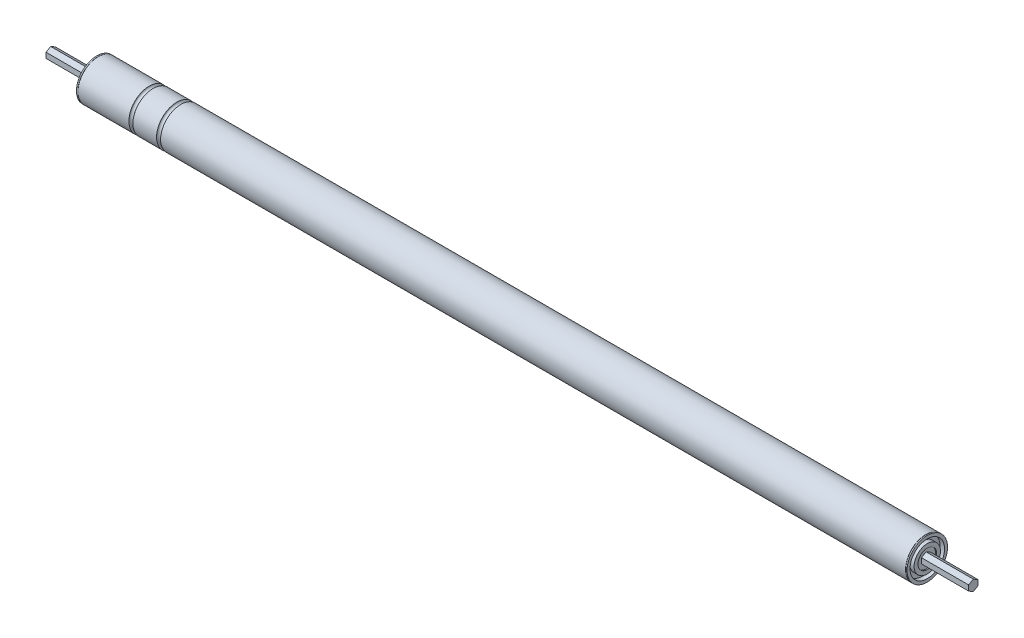
ISO-10303-21;
HEADER;
FILE_DESCRIPTION(('STEP AP214'),'2;1');
FILE_NAME('part.step','',(''),(''),'','','');
FILE_SCHEMA(('AUTOMOTIVE_DESIGN { 1 0 10303 214 1 1 1 1 }'));
ENDSEC;
DATA;
#1=APPLICATION_CONTEXT('core data for automotive mechanical design processes');
#2=APPLICATION_PROTOCOL_DEFINITION('international standard','automotive_design',2000,#1);
#3=PRODUCT_CONTEXT('',#1,'mechanical');
#4=PRODUCT('Part','Part','',(#3));
#5=PRODUCT_RELATED_PRODUCT_CATEGORY('part','',(#4));
#6=PRODUCT_DEFINITION_FORMATION('','',#4);
#7=PRODUCT_DEFINITION_CONTEXT('part definition',#1,'design');
#8=PRODUCT_DEFINITION('design','',#6,#7);
#9=PRODUCT_DEFINITION_SHAPE('','',#8);
#10=(LENGTH_UNIT() NAMED_UNIT(*) SI_UNIT(.MILLI.,.METRE.));
#11=(NAMED_UNIT(*) PLANE_ANGLE_UNIT() SI_UNIT($,.RADIAN.));
#12=(NAMED_UNIT(*) SI_UNIT($,.STERADIAN.) SOLID_ANGLE_UNIT());
#13=UNCERTAINTY_MEASURE_WITH_UNIT(LENGTH_MEASURE(1.E-05),#10,'distance_accuracy_value','');
#14=(GEOMETRIC_REPRESENTATION_CONTEXT(3) GLOBAL_UNCERTAINTY_ASSIGNED_CONTEXT((#13)) GLOBAL_UNIT_ASSIGNED_CONTEXT((#10,
#11,#12)) REPRESENTATION_CONTEXT('',''));
#15=CARTESIAN_POINT('',(0.,0.,0.));
#16=DIRECTION('',(0.,0.,1.));
#17=DIRECTION('',(1.,0.,0.));
#18=AXIS2_PLACEMENT_3D('',#15,#16,#17);
#19=CARTESIAN_POINT('',(556.234821520125,0.,0.));
#20=DIRECTION('',(-1.,0.,0.));
#21=DIRECTION('',(0.,0.,1.));
#22=AXIS2_PLACEMENT_3D('',#19,#20,#21);
#23=CYLINDRICAL_SURFACE('',#22,24.13);
#24=CARTESIAN_POINT('',(-427.830678291306,1.37139780605819E-13,0.));
#25=DIRECTION('',(1.,0.,0.));
#26=DIRECTION('',(0.,1.,0.));
#27=AXIS2_PLACEMENT_3D('',#24,#25,#26);
#28=CIRCLE('',#27,24.13);
#29=CARTESIAN_POINT('',(-427.830678291306,24.1300000000001,0.));
#30=VERTEX_POINT('',#29);
#31=EDGE_CURVE('E359',#30,#30,#28,.F.);
#32=ORIENTED_EDGE('',*,*,#31,.F.);
#33=EDGE_LOOP('',(#32));
#34=FACE_BOUND('',#33,.T.);
#35=CARTESIAN_POINT('',(-399.574321708694,1.26538187742656E-13,0.));
#36=DIRECTION('',(-1.,0.,0.));
#37=DIRECTION('',(0.,-1.,0.));
#38=AXIS2_PLACEMENT_3D('',#35,#36,#37);
#39=CIRCLE('',#38,24.13);
#40=CARTESIAN_POINT('',(-399.574321708693,-24.1299999999999,0.));
#41=VERTEX_POINT('',#40);
#42=EDGE_CURVE('E203',#41,#41,#39,.F.);
#43=ORIENTED_EDGE('',*,*,#42,.F.);
#44=EDGE_LOOP('',(#43));
#45=FACE_BOUND('',#44,.T.);
#46=ADVANCED_FACE('F39',(#34,#45),#23,.T.);
#47=CARTESIAN_POINT('',(-427.04385,1.38777878078145E-13,0.));
#48=DIRECTION('',(-1.,0.,0.));
#49=DIRECTION('',(0.,-1.,0.));
#50=AXIS2_PLACEMENT_3D('',#47,#48,#49);
#51=TOROIDAL_SURFACE('',#50,24.1000000000019,0.787399999999969);
#52=CARTESIAN_POINT('',(-427.83125,1.37158145291755E-13,0.));
#53=DIRECTION('',(-1.,0.,0.));
#54=DIRECTION('',(0.,-1.,0.));
#55=AXIS2_PLACEMENT_3D('',#52,#53,#54);
#56=CIRCLE('',#55,24.1000000000019);
#57=CARTESIAN_POINT('',(-427.83125,-24.1000000000017,0.));
#58=VERTEX_POINT('',#57);
#59=EDGE_CURVE('E208',#58,#58,#56,.T.);
#60=ORIENTED_EDGE('',*,*,#59,.F.);
#61=EDGE_LOOP('',(#60));
#62=FACE_BOUND('',#61,.T.);
#63=ORIENTED_EDGE('',*,*,#31,.T.);
#64=EDGE_LOOP('',(#63));
#65=FACE_BOUND('',#64,.T.);
#66=ADVANCED_FACE('F390',(#62,#65),#51,.T.);
#67=CARTESIAN_POINT('',(-433.38115,1.2490009027033E-13,0.));
#68=DIRECTION('',(-1.,0.,0.));
#69=DIRECTION('',(0.,-1.,0.));
#70=AXIS2_PLACEMENT_3D('',#67,#68,#69);
#71=TOROIDAL_SURFACE('',#70,24.1000000000019,0.787399999999969);
#72=CARTESIAN_POINT('',(-432.59375,1.27243098644159E-13,0.));
#73=DIRECTION('',(-1.,0.,0.));
#74=DIRECTION('',(0.,-1.,0.));
#75=AXIS2_PLACEMENT_3D('',#72,#73,#74);
#76=CIRCLE('',#75,24.1000000000019);
#77=CARTESIAN_POINT('',(-432.59375,-24.1000000000017,0.));
#78=VERTEX_POINT('',#77);
#79=EDGE_CURVE('E204',#78,#78,#76,.T.);
#80=ORIENTED_EDGE('',*,*,#79,.T.);
#81=EDGE_LOOP('',(#80));
#82=FACE_BOUND('',#81,.T.);
#83=CARTESIAN_POINT('',(-432.594321708693,1.26538187742656E-13,0.));
#84=DIRECTION('',(-1.,0.,0.));
#85=DIRECTION('',(0.,-1.,0.));
#86=AXIS2_PLACEMENT_3D('',#83,#84,#85);
#87=CIRCLE('',#86,24.13);
#88=CARTESIAN_POINT('',(-432.594321708693,-24.1299999999999,0.));
#89=VERTEX_POINT('',#88);
#90=EDGE_CURVE('E212',#89,#89,#87,.F.);
#91=ORIENTED_EDGE('',*,*,#90,.T.);
#92=EDGE_LOOP('',(#91));
#93=FACE_BOUND('',#92,.T.);
#94=ADVANCED_FACE('F409',(#82,#93),#71,.T.);
#95=CARTESIAN_POINT('',(-430.2125,1.31838984174237E-13,0.));
#96=DIRECTION('',(-1.,0.,0.));
#97=DIRECTION('',(0.,-1.,0.));
#98=AXIS2_PLACEMENT_3D('',#95,#96,#97);
#99=TOROIDAL_SURFACE('',#98,24.1000000000019,2.38124999999995);
#100=ORIENTED_EDGE('',*,*,#59,.T.);
#101=EDGE_LOOP('',(#100));
#102=FACE_BOUND('',#101,.T.);
#103=ORIENTED_EDGE('',*,*,#79,.F.);
#104=EDGE_LOOP('',(#103));
#105=FACE_BOUND('',#104,.T.);
#106=ADVANCED_FACE('F411',(#102,#105),#99,.F.);
#107=CARTESIAN_POINT('',(508.,-3.20790243318486,-5.55625));
#108=DIRECTION('',(0.,0.,1.));
#109=DIRECTION('',(1.,0.,0.));
#110=AXIS2_PLACEMENT_3D('',#107,#108,#109);
#111=PLANE('',#110);
#112=DIRECTION('',(-1.,0.,0.));
#113=VECTOR('',#112,1.);
#114=CARTESIAN_POINT('',(508.,3.20790243318486,-5.55625));
#115=LINE('',#114,#113);
#116=CARTESIAN_POINT('',(-493.7125,3.20790243318486,-5.55625));
#117=VERTEX_POINT('',#116);
#118=CARTESIAN_POINT('',(-550.,3.20790243318486,-5.55625));
#119=VERTEX_POINT('',#118);
#120=EDGE_CURVE('E154',#117,#119,#115,.T.);
#121=ORIENTED_EDGE('',*,*,#120,.F.);
#122=DIRECTION('',(0.,-1.,0.));
#123=VECTOR('',#122,1.);
#124=CARTESIAN_POINT('',(-493.7125,0.,-5.55625));
#125=LINE('',#124,#123);
#126=CARTESIAN_POINT('',(-493.7125,-3.20790243318486,-5.55625));
#127=VERTEX_POINT('',#126);
#128=EDGE_CURVE('E238',#117,#127,#125,.T.);
#129=ORIENTED_EDGE('',*,*,#128,.T.);
#130=DIRECTION('',(-1.,0.,0.));
#131=VECTOR('',#130,1.);
#132=CARTESIAN_POINT('',(508.,-3.20790243318486,-5.55625));
#133=LINE('',#132,#131);
#134=CARTESIAN_POINT('',(-550.,-3.20790243318486,-5.55625));
#135=VERTEX_POINT('',#134);
#136=EDGE_CURVE('E217',#127,#135,#133,.T.);
#137=ORIENTED_EDGE('',*,*,#136,.T.);
#138=DIRECTION('',(0.,1.,0.));
#139=VECTOR('',#138,1.);
#140=CARTESIAN_POINT('',(-550.,-3.20790243318486,-5.55625));
#141=LINE('',#140,#139);
#142=EDGE_CURVE('E168',#135,#119,#141,.T.);
#143=ORIENTED_EDGE('',*,*,#142,.T.);
#144=EDGE_LOOP('',(#121,#129,#137,#143));
#145=FACE_BOUND('',#144,.T.);
#146=ADVANCED_FACE('F418',(#145),#111,.F.);
#147=CARTESIAN_POINT('',(508.,-6.41580486636972,0.));
#148=DIRECTION('',(0.,0.866025403784439,0.5));
#149=DIRECTION('',(0.,-0.5,0.866025403784439));
#150=AXIS2_PLACEMENT_3D('',#147,#148,#149);
#151=PLANE('',#150);
#152=ORIENTED_EDGE('',*,*,#136,.F.);
#153=DIRECTION('',(0.,-0.5,0.866025403784439));
#154=VECTOR('',#153,1.);
#155=CARTESIAN_POINT('',(-493.7125,-4.81185364977729,-2.778125));
#156=LINE('',#155,#154);
#157=CARTESIAN_POINT('',(-493.7125,-6.41580486636971,0.));
#158=VERTEX_POINT('',#157);
#159=EDGE_CURVE('E242',#127,#158,#156,.T.);
#160=ORIENTED_EDGE('',*,*,#159,.T.);
#161=DIRECTION('',(-1.,0.,0.));
#162=VECTOR('',#161,1.);
#163=CARTESIAN_POINT('',(508.,-6.41580486636972,0.));
#164=LINE('',#163,#162);
#165=CARTESIAN_POINT('',(-550.,-6.41580486636972,0.));
#166=VERTEX_POINT('',#165);
#167=EDGE_CURVE('E222',#158,#166,#164,.T.);
#168=ORIENTED_EDGE('',*,*,#167,.T.);
#169=DIRECTION('',(0.,0.5,-0.866025403784439));
#170=VECTOR('',#169,1.);
#171=CARTESIAN_POINT('',(-550.,-6.41580486636972,0.));
#172=LINE('',#171,#170);
#173=EDGE_CURVE('E164',#166,#135,#172,.T.);
#174=ORIENTED_EDGE('',*,*,#173,.T.);
#175=EDGE_LOOP('',(#152,#160,#168,#174));
#176=FACE_BOUND('',#175,.T.);
#177=ADVANCED_FACE('F427',(#176),#151,.F.);
#178=CARTESIAN_POINT('',(508.,-3.20790243318486,5.55625));
#179=DIRECTION('',(0.,0.866025403784439,-0.5));
#180=DIRECTION('',(0.,0.5,0.866025403784439));
#181=AXIS2_PLACEMENT_3D('',#178,#179,#180);
#182=PLANE('',#181);
#183=ORIENTED_EDGE('',*,*,#167,.F.);
#184=DIRECTION('',(0.,0.5,0.866025403784439));
#185=VECTOR('',#184,1.);
#186=CARTESIAN_POINT('',(-493.7125,-4.81185364977729,2.778125));
#187=LINE('',#186,#185);
#188=CARTESIAN_POINT('',(-493.7125,-3.20790243318486,5.55625));
#189=VERTEX_POINT('',#188);
#190=EDGE_CURVE('E246',#158,#189,#187,.T.);
#191=ORIENTED_EDGE('',*,*,#190,.T.);
#192=DIRECTION('',(-1.,0.,0.));
#193=VECTOR('',#192,1.);
#194=CARTESIAN_POINT('',(508.,-3.20790243318486,5.55625));
#195=LINE('',#194,#193);
#196=CARTESIAN_POINT('',(-550.,-3.20790243318486,5.55625));
#197=VERTEX_POINT('',#196);
#198=EDGE_CURVE('E227',#189,#197,#195,.T.);
#199=ORIENTED_EDGE('',*,*,#198,.T.);
#200=DIRECTION('',(0.,-0.5,-0.866025403784439));
#201=VECTOR('',#200,1.);
#202=CARTESIAN_POINT('',(-550.,-3.20790243318486,5.55625));
#203=LINE('',#202,#201);
#204=EDGE_CURVE('E160',#197,#166,#203,.T.);
#205=ORIENTED_EDGE('',*,*,#204,.T.);
#206=EDGE_LOOP('',(#183,#191,#199,#205));
#207=FACE_BOUND('',#206,.T.);
#208=ADVANCED_FACE('F432',(#207),#182,.F.);
#209=CARTESIAN_POINT('',(508.,3.20790243318486,5.55625));
#210=DIRECTION('',(0.,0.,-1.));
#211=DIRECTION('',(-1.,0.,0.));
#212=AXIS2_PLACEMENT_3D('',#209,#210,#211);
#213=PLANE('',#212);
#214=ORIENTED_EDGE('',*,*,#198,.F.);
#215=DIRECTION('',(0.,1.,0.));
#216=VECTOR('',#215,1.);
#217=CARTESIAN_POINT('',(-493.7125,0.,5.55625));
#218=LINE('',#217,#216);
#219=CARTESIAN_POINT('',(-493.7125,3.20790243318486,5.55625));
#220=VERTEX_POINT('',#219);
#221=EDGE_CURVE('E250',#189,#220,#218,.T.);
#222=ORIENTED_EDGE('',*,*,#221,.T.);
#223=DIRECTION('',(-1.,0.,0.));
#224=VECTOR('',#223,1.);
#225=CARTESIAN_POINT('',(508.,3.20790243318486,5.55625));
#226=LINE('',#225,#224);
#227=CARTESIAN_POINT('',(-550.,3.20790243318486,5.55625));
#228=VERTEX_POINT('',#227);
#229=EDGE_CURVE('E232',#220,#228,#226,.T.);
#230=ORIENTED_EDGE('',*,*,#229,.T.);
#231=DIRECTION('',(0.,-1.,0.));
#232=VECTOR('',#231,1.);
#233=CARTESIAN_POINT('',(-550.,3.20790243318486,5.55625));
#234=LINE('',#233,#232);
#235=EDGE_CURVE('E149',#228,#197,#234,.T.);
#236=ORIENTED_EDGE('',*,*,#235,.T.);
#237=EDGE_LOOP('',(#214,#222,#230,#236));
#238=FACE_BOUND('',#237,.T.);
#239=ADVANCED_FACE('F437',(#238),#213,.F.);
#240=CARTESIAN_POINT('',(508.,6.41580486636972,0.));
#241=DIRECTION('',(0.,-0.866025403784439,-0.5));
#242=DIRECTION('',(0.,0.5,-0.866025403784439));
#243=AXIS2_PLACEMENT_3D('',#240,#241,#242);
#244=PLANE('',#243);
#245=ORIENTED_EDGE('',*,*,#229,.F.);
#246=DIRECTION('',(0.,0.5,-0.866025403784439));
#247=VECTOR('',#246,1.);
#248=CARTESIAN_POINT('',(-493.7125,4.81185364977729,2.778125));
#249=LINE('',#248,#247);
#250=CARTESIAN_POINT('',(-493.7125,6.41580486636972,0.));
#251=VERTEX_POINT('',#250);
#252=EDGE_CURVE('E61',#220,#251,#249,.T.);
#253=ORIENTED_EDGE('',*,*,#252,.T.);
#254=DIRECTION('',(-1.,0.,0.));
#255=VECTOR('',#254,1.);
#256=CARTESIAN_POINT('',(508.,6.41580486636972,0.));
#257=LINE('',#256,#255);
#258=CARTESIAN_POINT('',(-550.,6.41580486636972,0.));
#259=VERTEX_POINT('',#258);
#260=EDGE_CURVE('E129',#251,#259,#257,.T.);
#261=ORIENTED_EDGE('',*,*,#260,.T.);
#262=DIRECTION('',(0.,-0.5,0.866025403784439));
#263=VECTOR('',#262,1.);
#264=CARTESIAN_POINT('',(-550.,6.41580486636972,0.));
#265=LINE('',#264,#263);
#266=EDGE_CURVE('E133',#259,#228,#265,.T.);
#267=ORIENTED_EDGE('',*,*,#266,.T.);
#268=EDGE_LOOP('',(#245,#253,#261,#267));
#269=FACE_BOUND('',#268,.T.);
#270=ADVANCED_FACE('F132',(#269),#244,.F.);
#271=CARTESIAN_POINT('',(508.,3.20790243318486,-5.55625));
#272=DIRECTION('',(0.,-0.866025403784439,0.5));
#273=DIRECTION('',(0.,-0.5,-0.866025403784439));
#274=AXIS2_PLACEMENT_3D('',#271,#272,#273);
#275=PLANE('',#274);
#276=ORIENTED_EDGE('',*,*,#260,.F.);
#277=DIRECTION('',(0.,-0.5,-0.866025403784439));
#278=VECTOR('',#277,1.);
#279=CARTESIAN_POINT('',(-493.7125,4.81185364977729,-2.778125));
#280=LINE('',#279,#278);
#281=EDGE_CURVE('E57',#251,#117,#280,.T.);
#282=ORIENTED_EDGE('',*,*,#281,.T.);
#283=ORIENTED_EDGE('',*,*,#120,.T.);
#284=DIRECTION('',(0.,0.5,0.866025403784439));
#285=VECTOR('',#284,1.);
#286=CARTESIAN_POINT('',(-550.,3.20790243318486,-5.55625));
#287=LINE('',#286,#285);
#288=EDGE_CURVE('E145',#119,#259,#287,.T.);
#289=ORIENTED_EDGE('',*,*,#288,.T.);
#290=EDGE_LOOP('',(#276,#282,#283,#289));
#291=FACE_BOUND('',#290,.T.);
#292=ADVANCED_FACE('F152',(#291),#275,.F.);
#293=CARTESIAN_POINT('',(-493.7125,0.,0.));
#294=DIRECTION('',(1.,0.,0.));
#295=DIRECTION('',(0.,1.,0.));
#296=AXIS2_PLACEMENT_3D('',#293,#294,#295);
#297=PLANE('',#296);
#298=CARTESIAN_POINT('',(-493.7125,0.,0.));
#299=DIRECTION('',(-1.,0.,0.));
#300=DIRECTION('',(0.,-1.,0.));
#301=AXIS2_PLACEMENT_3D('',#298,#299,#300);
#302=CIRCLE('',#301,11.1125);
#303=CARTESIAN_POINT('',(-493.7125,-11.1125,0.));
#304=VERTEX_POINT('',#303);
#305=EDGE_CURVE('E317',#304,#304,#302,.T.);
#306=ORIENTED_EDGE('',*,*,#305,.T.);
#307=EDGE_LOOP('',(#306));
#308=FACE_BOUND('',#307,.T.);
#309=ORIENTED_EDGE('',*,*,#281,.F.);
#310=ORIENTED_EDGE('',*,*,#252,.F.);
#311=ORIENTED_EDGE('',*,*,#221,.F.);
#312=ORIENTED_EDGE('',*,*,#190,.F.);
#313=ORIENTED_EDGE('',*,*,#159,.F.);
#314=ORIENTED_EDGE('',*,*,#128,.F.);
#315=EDGE_LOOP('',(#309,#310,#311,#312,#313,#314));
#316=FACE_BOUND('',#315,.T.);
#317=ADVANCED_FACE('F448',(#308,#316),#297,.F.);
#318=CARTESIAN_POINT('',(-493.7125,0.,0.));
#319=DIRECTION('',(-1.,0.,0.));
#320=DIRECTION('',(0.,-1.,0.));
#321=AXIS2_PLACEMENT_3D('',#318,#319,#320);
#322=CYLINDRICAL_SURFACE('',#321,11.1125);
#323=ORIENTED_EDGE('',*,*,#305,.F.);
#324=EDGE_LOOP('',(#323));
#325=FACE_BOUND('',#324,.T.);
#326=CARTESIAN_POINT('',(-495.096875,0.,0.));
#327=DIRECTION('',(-1.,0.,0.));
#328=DIRECTION('',(0.,-1.,0.));
#329=AXIS2_PLACEMENT_3D('',#326,#327,#328);
#330=CIRCLE('',#329,11.1125);
#331=CARTESIAN_POINT('',(-495.096875,-11.1125,0.));
#332=VERTEX_POINT('',#331);
#333=EDGE_CURVE('E313',#332,#332,#330,.T.);
#334=ORIENTED_EDGE('',*,*,#333,.T.);
#335=EDGE_LOOP('',(#334));
#336=FACE_BOUND('',#335,.T.);
#337=ADVANCED_FACE('F573',(#325,#336),#322,.F.);
#338=CARTESIAN_POINT('',(-495.096875,-11.1125,0.));
#339=DIRECTION('',(1.,0.,0.));
#340=DIRECTION('',(0.,1.,0.));
#341=AXIS2_PLACEMENT_3D('',#338,#339,#340);
#342=PLANE('',#341);
#343=ORIENTED_EDGE('',*,*,#333,.F.);
#344=EDGE_LOOP('',(#343));
#345=FACE_BOUND('',#344,.T.);
#346=CARTESIAN_POINT('',(-495.096875,0.,0.));
#347=DIRECTION('',(-1.,0.,0.));
#348=DIRECTION('',(0.,-1.,0.));
#349=AXIS2_PLACEMENT_3D('',#346,#347,#348);
#350=CIRCLE('',#349,15.7129275651736);
#351=CARTESIAN_POINT('',(-495.096875,-15.7129275651736,0.));
#352=VERTEX_POINT('',#351);
#353=EDGE_CURVE('E309',#352,#352,#350,.T.);
#354=ORIENTED_EDGE('',*,*,#353,.T.);
#355=EDGE_LOOP('',(#354));
#356=FACE_BOUND('',#355,.T.);
#357=ADVANCED_FACE('F582',(#345,#356),#342,.F.);
#358=CARTESIAN_POINT('',(-493.7125,0.,0.));
#359=DIRECTION('',(-1.,0.,0.));
#360=DIRECTION('',(0.,-1.,0.));
#361=AXIS2_PLACEMENT_3D('',#358,#359,#360);
#362=CYLINDRICAL_SURFACE('',#361,15.7129275651736);
#363=ORIENTED_EDGE('',*,*,#353,.F.);
#364=EDGE_LOOP('',(#363));
#365=FACE_BOUND('',#364,.T.);
#366=CARTESIAN_POINT('',(-489.762875,0.,0.));
#367=DIRECTION('',(-1.,0.,0.));
#368=DIRECTION('',(0.,-1.,0.));
#369=AXIS2_PLACEMENT_3D('',#366,#367,#368);
#370=CIRCLE('',#369,15.7129275651736);
#371=CARTESIAN_POINT('',(-489.762875,-15.7129275651736,0.));
#372=VERTEX_POINT('',#371);
#373=EDGE_CURVE('E305',#372,#372,#370,.T.);
#374=ORIENTED_EDGE('',*,*,#373,.T.);
#375=EDGE_LOOP('',(#374));
#376=FACE_BOUND('',#375,.T.);
#377=ADVANCED_FACE('F590',(#365,#376),#362,.T.);
#378=CARTESIAN_POINT('',(-489.762875,-15.7129275651736,1.09722786744795E-13));
#379=DIRECTION('',(1.,0.,0.));
#380=DIRECTION('',(0.,1.,0.));
#381=AXIS2_PLACEMENT_3D('',#378,#379,#380);
#382=PLANE('',#381);
#383=ORIENTED_EDGE('',*,*,#373,.F.);
#384=EDGE_LOOP('',(#383));
#385=FACE_BOUND('',#384,.T.);
#386=CARTESIAN_POINT('',(-489.762875,0.,0.));
#387=DIRECTION('',(-1.,0.,0.));
#388=DIRECTION('',(0.,-1.,0.));
#389=AXIS2_PLACEMENT_3D('',#386,#387,#388);
#390=CIRCLE('',#389,20.574);
#391=CARTESIAN_POINT('',(-489.762875,-20.574,0.));
#392=VERTEX_POINT('',#391);
#393=EDGE_CURVE('E301',#392,#392,#390,.T.);
#394=ORIENTED_EDGE('',*,*,#393,.T.);
#395=EDGE_LOOP('',(#394));
#396=FACE_BOUND('',#395,.T.);
#397=ADVANCED_FACE('F598',(#385,#396),#382,.F.);
#398=CARTESIAN_POINT('',(-493.7125,0.,0.));
#399=DIRECTION('',(-1.,0.,0.));
#400=DIRECTION('',(0.,-1.,0.));
#401=AXIS2_PLACEMENT_3D('',#398,#399,#400);
#402=CYLINDRICAL_SURFACE('',#401,20.574);
#403=ORIENTED_EDGE('',*,*,#393,.F.);
#404=EDGE_LOOP('',(#403));
#405=FACE_BOUND('',#404,.T.);
#406=CARTESIAN_POINT('',(-495.096875,0.,0.));
#407=DIRECTION('',(-1.,0.,0.));
#408=DIRECTION('',(0.,-1.,0.));
#409=AXIS2_PLACEMENT_3D('',#406,#407,#408);
#410=CIRCLE('',#409,20.574);
#411=CARTESIAN_POINT('',(-495.096875,-20.574,0.));
#412=VERTEX_POINT('',#411);
#413=EDGE_CURVE('E297',#412,#412,#410,.T.);
#414=ORIENTED_EDGE('',*,*,#413,.T.);
#415=EDGE_LOOP('',(#414));
#416=FACE_BOUND('',#415,.T.);
#417=ADVANCED_FACE('F606',(#405,#416),#402,.F.);
#418=CARTESIAN_POINT('',(-495.096875,-24.13,1.6849888941257E-13));
#419=DIRECTION('',(1.,0.,0.));
#420=DIRECTION('',(0.,1.,0.));
#421=AXIS2_PLACEMENT_3D('',#418,#419,#420);
#422=PLANE('',#421);
#423=ORIENTED_EDGE('',*,*,#413,.F.);
#424=EDGE_LOOP('',(#423));
#425=FACE_BOUND('',#424,.T.);
#426=CARTESIAN_POINT('',(-495.096875,0.,0.));
#427=DIRECTION('',(-1.,0.,0.));
#428=DIRECTION('',(0.,-1.,0.));
#429=AXIS2_PLACEMENT_3D('',#426,#427,#428);
#430=CIRCLE('',#429,24.13);
#431=CARTESIAN_POINT('',(-495.096875,-24.13,0.));
#432=VERTEX_POINT('',#431);
#433=EDGE_CURVE('E293',#432,#432,#430,.T.);
#434=ORIENTED_EDGE('',*,*,#433,.T.);
#435=EDGE_LOOP('',(#434));
#436=FACE_BOUND('',#435,.T.);
#437=ADVANCED_FACE('F614',(#425,#436),#422,.F.);
#438=CARTESIAN_POINT('',(-493.7125,0.,0.));
#439=DIRECTION('',(-1.,0.,0.));
#440=DIRECTION('',(0.,-1.,0.));
#441=AXIS2_PLACEMENT_3D('',#438,#439,#440);
#442=CYLINDRICAL_SURFACE('',#441,24.13);
#443=CARTESIAN_POINT('',(-493.572875,0.,0.));
#444=DIRECTION('',(-1.,0.,0.));
#445=DIRECTION('',(0.,-1.,0.));
#446=AXIS2_PLACEMENT_3D('',#443,#444,#445);
#447=CIRCLE('',#446,24.13);
#448=CARTESIAN_POINT('',(-493.572875,-24.13,0.));
#449=VERTEX_POINT('',#448);
#450=EDGE_CURVE('E321',#449,#449,#447,.T.);
#451=ORIENTED_EDGE('',*,*,#450,.T.);
#452=EDGE_LOOP('',(#451));
#453=FACE_BOUND('',#452,.T.);
#454=ORIENTED_EDGE('',*,*,#433,.F.);
#455=EDGE_LOOP('',(#454));
#456=FACE_BOUND('',#455,.T.);
#457=ADVANCED_FACE('F622',(#453,#456),#442,.T.);
#458=CARTESIAN_POINT('',(-493.572875,0.,0.));
#459=DIRECTION('',(-1.,0.,0.));
#460=DIRECTION('',(0.,-1.,0.));
#461=AXIS2_PLACEMENT_3D('',#458,#459,#460);
#462=CONICAL_SURFACE('',#461,24.13,0.785398163397469);
#463=CARTESIAN_POINT('',(-493.318875,0.,0.));
#464=DIRECTION('',(-1.,0.,0.));
#465=DIRECTION('',(0.,-1.,0.));
#466=AXIS2_PLACEMENT_3D('',#463,#464,#465);
#467=CIRCLE('',#466,23.876);
#468=CARTESIAN_POINT('',(-493.318875,-23.876,0.));
#469=VERTEX_POINT('',#468);
#470=EDGE_CURVE('E325',#469,#469,#467,.F.);
#471=ORIENTED_EDGE('',*,*,#470,.F.);
#472=EDGE_LOOP('',(#471));
#473=FACE_BOUND('',#472,.T.);
#474=ORIENTED_EDGE('',*,*,#450,.F.);
#475=EDGE_LOOP('',(#474));
#476=FACE_BOUND('',#475,.T.);
#477=ADVANCED_FACE('F402',(#473,#476),#462,.T.);
#478=CARTESIAN_POINT('',(-493.318875,-24.13,1.6849888941257E-13));
#479=DIRECTION('',(-1.,0.,0.));
#480=DIRECTION('',(0.,-1.,0.));
#481=AXIS2_PLACEMENT_3D('',#478,#479,#480);
#482=PLANE('',#481);
#483=ORIENTED_EDGE('',*,*,#470,.T.);
#484=EDGE_LOOP('',(#483));
#485=FACE_BOUND('',#484,.T.);
#486=CARTESIAN_POINT('',(-493.318875,0.,0.));
#487=DIRECTION('',(-1.,0.,0.));
#488=DIRECTION('',(0.,-1.,0.));
#489=AXIS2_PLACEMENT_3D('',#486,#487,#488);
#490=CIRCLE('',#489,24.13);
#491=CARTESIAN_POINT('',(-493.318875,-24.13,0.));
#492=VERTEX_POINT('',#491);
#493=EDGE_CURVE('E261',#492,#492,#490,.T.);
#494=ORIENTED_EDGE('',*,*,#493,.T.);
#495=EDGE_LOOP('',(#494));
#496=FACE_BOUND('',#495,.T.);
#497=ADVANCED_FACE('F393',(#485,#496),#482,.T.);
#498=ORIENTED_EDGE('',*,*,#493,.F.);
#499=EDGE_LOOP('',(#498));
#500=FACE_BOUND('',#499,.T.);
#501=ORIENTED_EDGE('',*,*,#90,.F.);
#502=EDGE_LOOP('',(#501));
#503=FACE_BOUND('',#502,.T.);
#504=ADVANCED_FACE('F378',(#500,#503),#23,.T.);
#505=CARTESIAN_POINT('',(-394.02385,1.38777878078145E-13,0.));
#506=DIRECTION('',(-1.,0.,0.));
#507=DIRECTION('',(0.,-1.,0.));
#508=AXIS2_PLACEMENT_3D('',#505,#506,#507);
#509=TOROIDAL_SURFACE('',#508,24.1000000000019,0.787399999999969);
#510=CARTESIAN_POINT('',(-394.81125,1.37158145291755E-13,0.));
#511=DIRECTION('',(-1.,0.,0.));
#512=DIRECTION('',(0.,-1.,0.));
#513=AXIS2_PLACEMENT_3D('',#510,#511,#512);
#514=CIRCLE('',#513,24.1000000000019);
#515=CARTESIAN_POINT('',(-394.81125,-24.1000000000017,0.));
#516=VERTEX_POINT('',#515);
#517=EDGE_CURVE('E199',#516,#516,#514,.T.);
#518=ORIENTED_EDGE('',*,*,#517,.F.);
#519=EDGE_LOOP('',(#518));
#520=FACE_BOUND('',#519,.T.);
#521=CARTESIAN_POINT('',(-394.810678291306,1.37139780605819E-13,0.));
#522=DIRECTION('',(1.,0.,0.));
#523=DIRECTION('',(0.,1.,0.));
#524=AXIS2_PLACEMENT_3D('',#521,#522,#523);
#525=CIRCLE('',#524,24.13);
#526=CARTESIAN_POINT('',(-394.810678291306,24.1300000000001,0.));
#527=VERTEX_POINT('',#526);
#528=EDGE_CURVE('E43',#527,#527,#525,.F.);
#529=ORIENTED_EDGE('',*,*,#528,.T.);
#530=EDGE_LOOP('',(#529));
#531=FACE_BOUND('',#530,.T.);
#532=ADVANCED_FACE('F370',(#520,#531),#509,.T.);
#533=CARTESIAN_POINT('',(-400.36115,1.2490009027033E-13,0.));
#534=DIRECTION('',(-1.,0.,0.));
#535=DIRECTION('',(0.,-1.,0.));
#536=AXIS2_PLACEMENT_3D('',#533,#534,#535);
#537=TOROIDAL_SURFACE('',#536,24.1000000000019,0.787399999999969);
#538=CARTESIAN_POINT('',(-399.57375,1.27243098644159E-13,0.));
#539=DIRECTION('',(-1.,0.,0.));
#540=DIRECTION('',(0.,-1.,0.));
#541=AXIS2_PLACEMENT_3D('',#538,#539,#540);
#542=CIRCLE('',#541,24.1000000000019);
#543=CARTESIAN_POINT('',(-399.57375,-24.1000000000017,0.));
#544=VERTEX_POINT('',#543);
#545=EDGE_CURVE('E195',#544,#544,#542,.T.);
#546=ORIENTED_EDGE('',*,*,#545,.T.);
#547=EDGE_LOOP('',(#546));
#548=FACE_BOUND('',#547,.T.);
#549=ORIENTED_EDGE('',*,*,#42,.T.);
#550=EDGE_LOOP('',(#549));
#551=FACE_BOUND('',#550,.T.);
#552=ADVANCED_FACE('F399',(#548,#551),#537,.T.);
#553=CARTESIAN_POINT('',(-397.1925,1.31838984174237E-13,0.));
#554=DIRECTION('',(-1.,0.,0.));
#555=DIRECTION('',(0.,-1.,0.));
#556=AXIS2_PLACEMENT_3D('',#553,#554,#555);
#557=TOROIDAL_SURFACE('',#556,24.1000000000019,2.38124999999995);
#558=ORIENTED_EDGE('',*,*,#517,.T.);
#559=EDGE_LOOP('',(#558));
#560=FACE_BOUND('',#559,.T.);
#561=ORIENTED_EDGE('',*,*,#545,.F.);
#562=EDGE_LOOP('',(#561));
#563=FACE_BOUND('',#562,.T.);
#564=ADVANCED_FACE('F499',(#560,#563),#557,.F.);
#565=CARTESIAN_POINT('',(550.,6.41580486636972,0.));
#566=VERTEX_POINT('',#565);
#567=CARTESIAN_POINT('',(493.7125,6.41580486636972,0.));
#568=VERTEX_POINT('',#567);
#569=EDGE_CURVE('E137',#566,#568,#257,.T.);
#570=ORIENTED_EDGE('',*,*,#569,.T.);
#571=DIRECTION('',(0.,-0.5,0.866025403784439));
#572=VECTOR('',#571,1.);
#573=CARTESIAN_POINT('',(493.7125,4.81185364977729,2.778125));
#574=LINE('',#573,#572);
#575=CARTESIAN_POINT('',(493.7125,3.20790243318486,5.55625));
#576=VERTEX_POINT('',#575);
#577=EDGE_CURVE('E49',#568,#576,#574,.T.);
#578=ORIENTED_EDGE('',*,*,#577,.T.);
#579=CARTESIAN_POINT('',(550.,3.20790243318486,5.55625));
#580=VERTEX_POINT('',#579);
#581=EDGE_CURVE('E138',#580,#576,#226,.T.);
#582=ORIENTED_EDGE('',*,*,#581,.F.);
#583=DIRECTION('',(0.,-0.5,0.866025403784439));
#584=VECTOR('',#583,1.);
#585=CARTESIAN_POINT('',(550.,6.41580486636972,0.));
#586=LINE('',#585,#584);
#587=EDGE_CURVE('E175',#566,#580,#586,.T.);
#588=ORIENTED_EDGE('',*,*,#587,.F.);
#589=EDGE_LOOP('',(#570,#578,#582,#588));
#590=FACE_BOUND('',#589,.T.);
#591=ADVANCED_FACE('F446',(#590),#244,.F.);
#592=ORIENTED_EDGE('',*,*,#581,.T.);
#593=DIRECTION('',(0.,-1.,0.));
#594=VECTOR('',#593,1.);
#595=CARTESIAN_POINT('',(493.7125,0.,5.55625));
#596=LINE('',#595,#594);
#597=CARTESIAN_POINT('',(493.7125,-3.20790243318486,5.55625));
#598=VERTEX_POINT('',#597);
#599=EDGE_CURVE('E349',#576,#598,#596,.T.);
#600=ORIENTED_EDGE('',*,*,#599,.T.);
#601=CARTESIAN_POINT('',(550.,-3.20790243318486,5.55625));
#602=VERTEX_POINT('',#601);
#603=EDGE_CURVE('E228',#602,#598,#195,.T.);
#604=ORIENTED_EDGE('',*,*,#603,.F.);
#605=DIRECTION('',(0.,-1.,0.));
#606=VECTOR('',#605,1.);
#607=CARTESIAN_POINT('',(550.,3.20790243318486,5.55625));
#608=LINE('',#607,#606);
#609=EDGE_CURVE('E179',#580,#602,#608,.T.);
#610=ORIENTED_EDGE('',*,*,#609,.F.);
#611=EDGE_LOOP('',(#592,#600,#604,#610));
#612=FACE_BOUND('',#611,.T.);
#613=ADVANCED_FACE('F443',(#612),#213,.F.);
#614=ORIENTED_EDGE('',*,*,#603,.T.);
#615=DIRECTION('',(0.,-0.5,-0.866025403784439));
#616=VECTOR('',#615,1.);
#617=CARTESIAN_POINT('',(493.7125,-4.81185364977729,2.778125));
#618=LINE('',#617,#616);
#619=CARTESIAN_POINT('',(493.7125,-6.41580486636971,0.));
#620=VERTEX_POINT('',#619);
#621=EDGE_CURVE('E345',#598,#620,#618,.T.);
#622=ORIENTED_EDGE('',*,*,#621,.T.);
#623=CARTESIAN_POINT('',(550.,-6.41580486636972,0.));
#624=VERTEX_POINT('',#623);
#625=EDGE_CURVE('E223',#624,#620,#164,.T.);
#626=ORIENTED_EDGE('',*,*,#625,.F.);
#627=DIRECTION('',(0.,-0.5,-0.866025403784439));
#628=VECTOR('',#627,1.);
#629=CARTESIAN_POINT('',(550.,-3.20790243318486,5.55625));
#630=LINE('',#629,#628);
#631=EDGE_CURVE('E183',#602,#624,#630,.T.);
#632=ORIENTED_EDGE('',*,*,#631,.F.);
#633=EDGE_LOOP('',(#614,#622,#626,#632));
#634=FACE_BOUND('',#633,.T.);
#635=ADVANCED_FACE('F439',(#634),#182,.F.);
#636=ORIENTED_EDGE('',*,*,#625,.T.);
#637=DIRECTION('',(0.,0.5,-0.866025403784439));
#638=VECTOR('',#637,1.);
#639=CARTESIAN_POINT('',(493.7125,-4.81185364977729,-2.778125));
#640=LINE('',#639,#638);
#641=CARTESIAN_POINT('',(493.7125,-3.20790243318486,-5.55625));
#642=VERTEX_POINT('',#641);
#643=EDGE_CURVE('E341',#620,#642,#640,.T.);
#644=ORIENTED_EDGE('',*,*,#643,.T.);
#645=CARTESIAN_POINT('',(550.,-3.20790243318486,-5.55625));
#646=VERTEX_POINT('',#645);
#647=EDGE_CURVE('E218',#646,#642,#133,.T.);
#648=ORIENTED_EDGE('',*,*,#647,.F.);
#649=DIRECTION('',(0.,0.5,-0.866025403784439));
#650=VECTOR('',#649,1.);
#651=CARTESIAN_POINT('',(550.,-6.41580486636972,0.));
#652=LINE('',#651,#650);
#653=EDGE_CURVE('E187',#624,#646,#652,.T.);
#654=ORIENTED_EDGE('',*,*,#653,.F.);
#655=EDGE_LOOP('',(#636,#644,#648,#654));
#656=FACE_BOUND('',#655,.T.);
#657=ADVANCED_FACE('F434',(#656),#151,.F.);
#658=ORIENTED_EDGE('',*,*,#647,.T.);
#659=DIRECTION('',(0.,1.,0.));
#660=VECTOR('',#659,1.);
#661=CARTESIAN_POINT('',(493.7125,0.,-5.55625));
#662=LINE('',#661,#660);
#663=CARTESIAN_POINT('',(493.7125,3.20790243318486,-5.55625));
#664=VERTEX_POINT('',#663);
#665=EDGE_CURVE('E337',#642,#664,#662,.T.);
#666=ORIENTED_EDGE('',*,*,#665,.T.);
#667=CARTESIAN_POINT('',(550.,3.20790243318486,-5.55625));
#668=VERTEX_POINT('',#667);
#669=EDGE_CURVE('E213',#668,#664,#115,.T.);
#670=ORIENTED_EDGE('',*,*,#669,.F.);
#671=DIRECTION('',(0.,1.,0.));
#672=VECTOR('',#671,1.);
#673=CARTESIAN_POINT('',(550.,-3.20790243318486,-5.55625));
#674=LINE('',#673,#672);
#675=EDGE_CURVE('E191',#646,#668,#674,.T.);
#676=ORIENTED_EDGE('',*,*,#675,.F.);
#677=EDGE_LOOP('',(#658,#666,#670,#676));
#678=FACE_BOUND('',#677,.T.);
#679=ADVANCED_FACE('F429',(#678),#111,.F.);
#680=ORIENTED_EDGE('',*,*,#669,.T.);
#681=DIRECTION('',(0.,0.5,0.866025403784439));
#682=VECTOR('',#681,1.);
#683=CARTESIAN_POINT('',(493.7125,4.81185364977729,-2.778125));
#684=LINE('',#683,#682);
#685=EDGE_CURVE('E11',#664,#568,#684,.T.);
#686=ORIENTED_EDGE('',*,*,#685,.T.);
#687=ORIENTED_EDGE('',*,*,#569,.F.);
#688=DIRECTION('',(0.,0.5,0.866025403784439));
#689=VECTOR('',#688,1.);
#690=CARTESIAN_POINT('',(550.,3.20790243318486,-5.55625));
#691=LINE('',#690,#689);
#692=EDGE_CURVE('E171',#668,#566,#691,.T.);
#693=ORIENTED_EDGE('',*,*,#692,.F.);
#694=EDGE_LOOP('',(#680,#686,#687,#693));
#695=FACE_BOUND('',#694,.T.);
#696=ADVANCED_FACE('F449',(#695),#275,.F.);
#697=CARTESIAN_POINT('',(493.7125,0.,0.));
#698=DIRECTION('',(-1.,0.,0.));
#699=DIRECTION('',(0.,1.,0.));
#700=AXIS2_PLACEMENT_3D('',#697,#698,#699);
#701=PLANE('',#700);
#702=CARTESIAN_POINT('',(493.7125,0.,0.));
#703=DIRECTION('',(-1.,0.,0.));
#704=DIRECTION('',(0.,-1.,0.));
#705=AXIS2_PLACEMENT_3D('',#702,#703,#704);
#706=CIRCLE('',#705,11.1125);
#707=CARTESIAN_POINT('',(493.7125,-11.1125,0.));
#708=VERTEX_POINT('',#707);
#709=EDGE_CURVE('E289',#708,#708,#706,.T.);
#710=ORIENTED_EDGE('',*,*,#709,.F.);
#711=EDGE_LOOP('',(#710));
#712=FACE_BOUND('',#711,.T.);
#713=ORIENTED_EDGE('',*,*,#685,.F.);
#714=ORIENTED_EDGE('',*,*,#665,.F.);
#715=ORIENTED_EDGE('',*,*,#643,.F.);
#716=ORIENTED_EDGE('',*,*,#621,.F.);
#717=ORIENTED_EDGE('',*,*,#599,.F.);
#718=ORIENTED_EDGE('',*,*,#577,.F.);
#719=EDGE_LOOP('',(#713,#714,#715,#716,#717,#718));
#720=FACE_BOUND('',#719,.T.);
#721=ADVANCED_FACE('F477',(#712,#720),#701,.F.);
#722=CARTESIAN_POINT('',(493.7125,0.,0.));
#723=DIRECTION('',(1.,0.,0.));
#724=DIRECTION('',(0.,-1.,0.));
#725=AXIS2_PLACEMENT_3D('',#722,#723,#724);
#726=CYLINDRICAL_SURFACE('',#725,11.1125);
#727=ORIENTED_EDGE('',*,*,#709,.T.);
#728=EDGE_LOOP('',(#727));
#729=FACE_BOUND('',#728,.T.);
#730=CARTESIAN_POINT('',(495.096875,0.,0.));
#731=DIRECTION('',(-1.,0.,0.));
#732=DIRECTION('',(0.,-1.,0.));
#733=AXIS2_PLACEMENT_3D('',#730,#731,#732);
#734=CIRCLE('',#733,11.1125);
#735=CARTESIAN_POINT('',(495.096875,-11.1125,0.));
#736=VERTEX_POINT('',#735);
#737=EDGE_CURVE('E285',#736,#736,#734,.T.);
#738=ORIENTED_EDGE('',*,*,#737,.F.);
#739=EDGE_LOOP('',(#738));
#740=FACE_BOUND('',#739,.T.);
#741=ADVANCED_FACE('F474',(#729,#740),#726,.F.);
#742=CARTESIAN_POINT('',(495.096875,-11.1125,0.));
#743=DIRECTION('',(-1.,0.,0.));
#744=DIRECTION('',(0.,1.,0.));
#745=AXIS2_PLACEMENT_3D('',#742,#743,#744);
#746=PLANE('',#745);
#747=ORIENTED_EDGE('',*,*,#737,.T.);
#748=EDGE_LOOP('',(#747));
#749=FACE_BOUND('',#748,.T.);
#750=CARTESIAN_POINT('',(495.096875,0.,0.));
#751=DIRECTION('',(-1.,0.,0.));
#752=DIRECTION('',(0.,-1.,0.));
#753=AXIS2_PLACEMENT_3D('',#750,#751,#752);
#754=CIRCLE('',#753,15.7129275651736);
#755=CARTESIAN_POINT('',(495.096875,-15.7129275651736,0.));
#756=VERTEX_POINT('',#755);
#757=EDGE_CURVE('E281',#756,#756,#754,.T.);
#758=ORIENTED_EDGE('',*,*,#757,.F.);
#759=EDGE_LOOP('',(#758));
#760=FACE_BOUND('',#759,.T.);
#761=ADVANCED_FACE('F470',(#749,#760),#746,.F.);
#762=CARTESIAN_POINT('',(493.7125,0.,0.));
#763=DIRECTION('',(1.,0.,0.));
#764=DIRECTION('',(0.,-1.,0.));
#765=AXIS2_PLACEMENT_3D('',#762,#763,#764);
#766=CYLINDRICAL_SURFACE('',#765,15.7129275651736);
#767=ORIENTED_EDGE('',*,*,#757,.T.);
#768=EDGE_LOOP('',(#767));
#769=FACE_BOUND('',#768,.T.);
#770=CARTESIAN_POINT('',(489.762875,0.,0.));
#771=DIRECTION('',(-1.,0.,0.));
#772=DIRECTION('',(0.,-1.,0.));
#773=AXIS2_PLACEMENT_3D('',#770,#771,#772);
#774=CIRCLE('',#773,15.7129275651736);
#775=CARTESIAN_POINT('',(489.762875,-15.7129275651736,0.));
#776=VERTEX_POINT('',#775);
#777=EDGE_CURVE('E277',#776,#776,#774,.T.);
#778=ORIENTED_EDGE('',*,*,#777,.F.);
#779=EDGE_LOOP('',(#778));
#780=FACE_BOUND('',#779,.T.);
#781=ADVANCED_FACE('F466',(#769,#780),#766,.T.);
#782=CARTESIAN_POINT('',(489.762875,-15.7129275651736,1.09722786744795E-13));
#783=DIRECTION('',(-1.,0.,0.));
#784=DIRECTION('',(0.,1.,0.));
#785=AXIS2_PLACEMENT_3D('',#782,#783,#784);
#786=PLANE('',#785);
#787=ORIENTED_EDGE('',*,*,#777,.T.);
#788=EDGE_LOOP('',(#787));
#789=FACE_BOUND('',#788,.T.);
#790=CARTESIAN_POINT('',(489.762875,0.,0.));
#791=DIRECTION('',(-1.,0.,0.));
#792=DIRECTION('',(0.,-1.,0.));
#793=AXIS2_PLACEMENT_3D('',#790,#791,#792);
#794=CIRCLE('',#793,20.574);
#795=CARTESIAN_POINT('',(489.762875,-20.574,0.));
#796=VERTEX_POINT('',#795);
#797=EDGE_CURVE('E273',#796,#796,#794,.T.);
#798=ORIENTED_EDGE('',*,*,#797,.F.);
#799=EDGE_LOOP('',(#798));
#800=FACE_BOUND('',#799,.T.);
#801=ADVANCED_FACE('F462',(#789,#800),#786,.F.);
#802=CARTESIAN_POINT('',(493.7125,0.,0.));
#803=DIRECTION('',(1.,0.,0.));
#804=DIRECTION('',(0.,-1.,0.));
#805=AXIS2_PLACEMENT_3D('',#802,#803,#804);
#806=CYLINDRICAL_SURFACE('',#805,20.574);
#807=ORIENTED_EDGE('',*,*,#797,.T.);
#808=EDGE_LOOP('',(#807));
#809=FACE_BOUND('',#808,.T.);
#810=CARTESIAN_POINT('',(495.096875,0.,0.));
#811=DIRECTION('',(-1.,0.,0.));
#812=DIRECTION('',(0.,-1.,0.));
#813=AXIS2_PLACEMENT_3D('',#810,#811,#812);
#814=CIRCLE('',#813,20.574);
#815=CARTESIAN_POINT('',(495.096875,-20.574,0.));
#816=VERTEX_POINT('',#815);
#817=EDGE_CURVE('E269',#816,#816,#814,.T.);
#818=ORIENTED_EDGE('',*,*,#817,.F.);
#819=EDGE_LOOP('',(#818));
#820=FACE_BOUND('',#819,.T.);
#821=ADVANCED_FACE('F458',(#809,#820),#806,.F.);
#822=CARTESIAN_POINT('',(495.096875,-24.13,1.6849888941257E-13));
#823=DIRECTION('',(-1.,0.,0.));
#824=DIRECTION('',(0.,1.,0.));
#825=AXIS2_PLACEMENT_3D('',#822,#823,#824);
#826=PLANE('',#825);
#827=ORIENTED_EDGE('',*,*,#817,.T.);
#828=EDGE_LOOP('',(#827));
#829=FACE_BOUND('',#828,.T.);
#830=CARTESIAN_POINT('',(495.096875,0.,0.));
#831=DIRECTION('',(-1.,0.,0.));
#832=DIRECTION('',(0.,-1.,0.));
#833=AXIS2_PLACEMENT_3D('',#830,#831,#832);
#834=CIRCLE('',#833,24.13);
#835=CARTESIAN_POINT('',(495.096875,-24.13,0.));
#836=VERTEX_POINT('',#835);
#837=EDGE_CURVE('E265',#836,#836,#834,.T.);
#838=ORIENTED_EDGE('',*,*,#837,.F.);
#839=EDGE_LOOP('',(#838));
#840=FACE_BOUND('',#839,.T.);
#841=ADVANCED_FACE('F454',(#829,#840),#826,.F.);
#842=CARTESIAN_POINT('',(493.7125,0.,0.));
#843=DIRECTION('',(1.,0.,0.));
#844=DIRECTION('',(0.,-1.,0.));
#845=AXIS2_PLACEMENT_3D('',#842,#843,#844);
#846=CYLINDRICAL_SURFACE('',#845,24.13);
#847=CARTESIAN_POINT('',(493.572875,0.,0.));
#848=DIRECTION('',(1.,0.,0.));
#849=DIRECTION('',(0.,1.,0.));
#850=AXIS2_PLACEMENT_3D('',#847,#848,#849);
#851=CIRCLE('',#850,24.13);
#852=CARTESIAN_POINT('',(493.572875,24.13,0.));
#853=VERTEX_POINT('',#852);
#854=EDGE_CURVE('E333',#853,#853,#851,.T.);
#855=ORIENTED_EDGE('',*,*,#854,.T.);
#856=EDGE_LOOP('',(#855));
#857=FACE_BOUND('',#856,.T.);
#858=ORIENTED_EDGE('',*,*,#837,.T.);
#859=EDGE_LOOP('',(#858));
#860=FACE_BOUND('',#859,.T.);
#861=ADVANCED_FACE('F451',(#857,#860),#846,.T.);
#862=CARTESIAN_POINT('',(493.318875,0.,0.));
#863=DIRECTION('',(1.,0.,0.));
#864=DIRECTION('',(0.,1.,0.));
#865=AXIS2_PLACEMENT_3D('',#862,#863,#864);
#866=CONICAL_SURFACE('',#865,23.876,0.785398163397585);
#867=ORIENTED_EDGE('',*,*,#854,.F.);
#868=EDGE_LOOP('',(#867));
#869=FACE_BOUND('',#868,.T.);
#870=CARTESIAN_POINT('',(493.318875,0.,0.));
#871=DIRECTION('',(1.,0.,0.));
#872=DIRECTION('',(0.,1.,0.));
#873=AXIS2_PLACEMENT_3D('',#870,#871,#872);
#874=CIRCLE('',#873,23.876);
#875=CARTESIAN_POINT('',(493.318875,23.876,0.));
#876=VERTEX_POINT('',#875);
#877=EDGE_CURVE('E329',#876,#876,#874,.F.);
#878=ORIENTED_EDGE('',*,*,#877,.F.);
#879=EDGE_LOOP('',(#878));
#880=FACE_BOUND('',#879,.T.);
#881=ADVANCED_FACE('F41',(#869,#880),#866,.T.);
#882=CARTESIAN_POINT('',(493.318875,-24.13,1.6849888941257E-13));
#883=DIRECTION('',(1.,0.,0.));
#884=DIRECTION('',(0.,-1.,0.));
#885=AXIS2_PLACEMENT_3D('',#882,#883,#884);
#886=PLANE('',#885);
#887=ORIENTED_EDGE('',*,*,#877,.T.);
#888=EDGE_LOOP('',(#887));
#889=FACE_BOUND('',#888,.T.);
#890=CARTESIAN_POINT('',(493.318875,0.,0.));
#891=DIRECTION('',(1.,0.,0.));
#892=DIRECTION('',(0.,1.,0.));
#893=AXIS2_PLACEMENT_3D('',#890,#891,#892);
#894=CIRCLE('',#893,24.13);
#895=CARTESIAN_POINT('',(493.318875,24.13,0.));
#896=VERTEX_POINT('',#895);
#897=EDGE_CURVE('E257',#896,#896,#894,.F.);
#898=ORIENTED_EDGE('',*,*,#897,.F.);
#899=EDGE_LOOP('',(#898));
#900=FACE_BOUND('',#899,.T.);
#901=ADVANCED_FACE('F375',(#889,#900),#886,.T.);
#902=ORIENTED_EDGE('',*,*,#897,.T.);
#903=EDGE_LOOP('',(#902));
#904=FACE_BOUND('',#903,.T.);
#905=ORIENTED_EDGE('',*,*,#528,.F.);
#906=EDGE_LOOP('',(#905));
#907=FACE_BOUND('',#906,.T.);
#908=ADVANCED_FACE('F372',(#904,#907),#23,.T.);
#909=CARTESIAN_POINT('',(550.,0.,0.));
#910=DIRECTION('',(1.,0.,0.));
#911=DIRECTION('',(0.,0.,-1.));
#912=AXIS2_PLACEMENT_3D('',#909,#910,#911);
#913=PLANE('',#912);
#914=ORIENTED_EDGE('',*,*,#692,.T.);
#915=ORIENTED_EDGE('',*,*,#587,.T.);
#916=ORIENTED_EDGE('',*,*,#609,.T.);
#917=ORIENTED_EDGE('',*,*,#631,.T.);
#918=ORIENTED_EDGE('',*,*,#653,.T.);
#919=ORIENTED_EDGE('',*,*,#675,.T.);
#920=EDGE_LOOP('',(#914,#915,#916,#917,#918,#919));
#921=FACE_BOUND('',#920,.T.);
#922=ADVANCED_FACE('F374',(#921),#913,.T.);
#923=CARTESIAN_POINT('',(-550.,0.,0.));
#924=DIRECTION('',(1.,0.,0.));
#925=DIRECTION('',(0.,0.,-1.));
#926=AXIS2_PLACEMENT_3D('',#923,#924,#925);
#927=PLANE('',#926);
#928=ORIENTED_EDGE('',*,*,#288,.F.);
#929=ORIENTED_EDGE('',*,*,#142,.F.);
#930=ORIENTED_EDGE('',*,*,#173,.F.);
#931=ORIENTED_EDGE('',*,*,#204,.F.);
#932=ORIENTED_EDGE('',*,*,#235,.F.);
#933=ORIENTED_EDGE('',*,*,#266,.F.);
#934=EDGE_LOOP('',(#928,#929,#930,#931,#932,#933));
#935=FACE_BOUND('',#934,.T.);
#936=ADVANCED_FACE('F143',(#935),#927,.F.);
#937=CLOSED_SHELL('',(#46,#66,#94,#106,#146,#177,#208,#239,#270,#292,#317,#337,#357,#377,#397,
#417,#437,#457,#477,#497,#504,#532,#552,#564,#591,#613,#635,#657,#679,#696,#721,#741,#761,#781,
#801,#821,#841,#861,#881,#901,#908,#922,#936));
#938=MANIFOLD_SOLID_BREP('B2',#937);
#939=ADVANCED_BREP_SHAPE_REPRESENTATION('',(#18,#938),#14);
#940=SHAPE_DEFINITION_REPRESENTATION(#9,#939);
ENDSEC;
END-ISO-10303-21;
